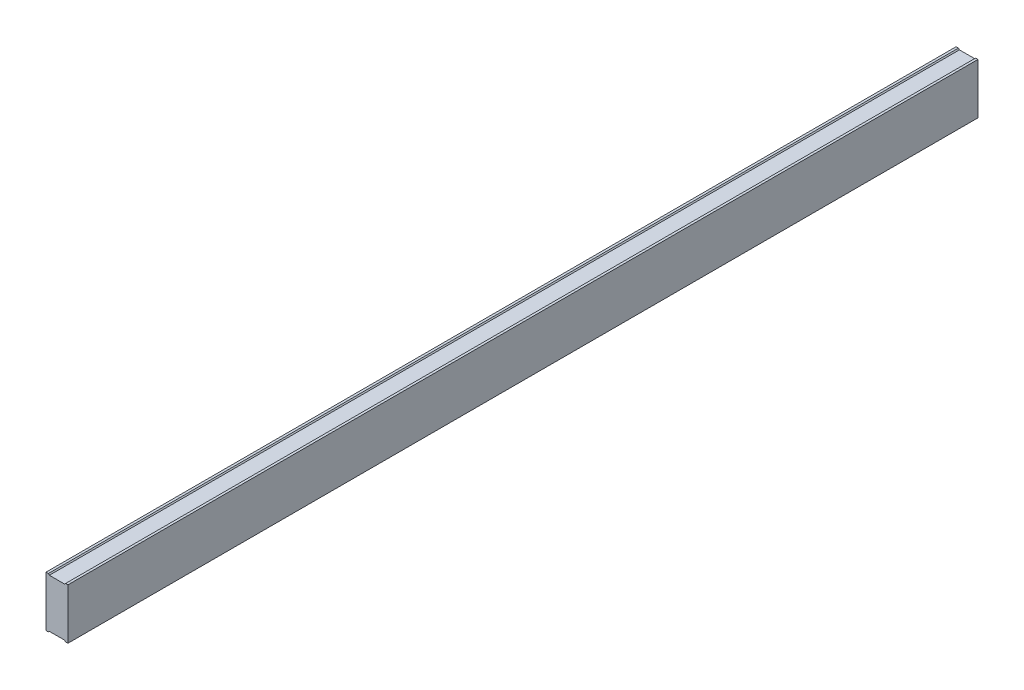
ISO-10303-21;
HEADER;
FILE_DESCRIPTION(('STEP AP214'),'2;1');
FILE_NAME('part.step','',(''),(''),'','','');
FILE_SCHEMA(('AUTOMOTIVE_DESIGN { 1 0 10303 214 1 1 1 1 }'));
ENDSEC;
DATA;
#1=APPLICATION_CONTEXT('core data for automotive mechanical design processes');
#2=APPLICATION_PROTOCOL_DEFINITION('international standard','automotive_design',2000,#1);
#3=PRODUCT_CONTEXT('',#1,'mechanical');
#4=PRODUCT('Part','Part','',(#3));
#5=PRODUCT_RELATED_PRODUCT_CATEGORY('part','',(#4));
#6=PRODUCT_DEFINITION_FORMATION('','',#4);
#7=PRODUCT_DEFINITION_CONTEXT('part definition',#1,'design');
#8=PRODUCT_DEFINITION('design','',#6,#7);
#9=PRODUCT_DEFINITION_SHAPE('','',#8);
#10=(LENGTH_UNIT() NAMED_UNIT(*) SI_UNIT(.MILLI.,.METRE.));
#11=(NAMED_UNIT(*) PLANE_ANGLE_UNIT() SI_UNIT($,.RADIAN.));
#12=(NAMED_UNIT(*) SI_UNIT($,.STERADIAN.) SOLID_ANGLE_UNIT());
#13=UNCERTAINTY_MEASURE_WITH_UNIT(LENGTH_MEASURE(1.E-05),#10,'distance_accuracy_value','');
#14=(GEOMETRIC_REPRESENTATION_CONTEXT(3) GLOBAL_UNCERTAINTY_ASSIGNED_CONTEXT((#13)) GLOBAL_UNIT_ASSIGNED_CONTEXT((#10,
#11,#12)) REPRESENTATION_CONTEXT('',''));
#15=CARTESIAN_POINT('',(0.,0.,0.));
#16=DIRECTION('',(0.,0.,1.));
#17=DIRECTION('',(1.,0.,0.));
#18=AXIS2_PLACEMENT_3D('',#15,#16,#17);
#19=CARTESIAN_POINT('',(11681.2400274227,-58136.4132239477,2697.));
#20=DIRECTION('',(2.45014736468445E-13,1.,0.));
#21=DIRECTION('',(-1.,2.45014736468445E-13,0.));
#22=AXIS2_PLACEMENT_3D('',#19,#20,#21);
#23=PLANE('',#22);
#24=DIRECTION('',(0.,0.,-1.));
#25=VECTOR('',#24,1.);
#26=CARTESIAN_POINT('',(11681.2400274227,-58136.4132239477,2697.));
#27=LINE('',#26,#25);
#28=CARTESIAN_POINT('',(11681.2400274227,-58136.4132239477,2691.));
#29=VERTEX_POINT('',#28);
#30=CARTESIAN_POINT('',(11681.2400274227,-58136.4132239477,5.99999999999978));
#31=VERTEX_POINT('',#30);
#32=EDGE_CURVE('E249',#29,#31,#27,.T.);
#33=ORIENTED_EDGE('',*,*,#32,.T.);
#34=DIRECTION('',(1.,0.,0.));
#35=VECTOR('',#34,1.);
#36=CARTESIAN_POINT('',(11681.2400274227,-58136.4132239477,6.));
#37=LINE('',#36,#35);
#38=CARTESIAN_POINT('',(11739.2400274228,-58136.4132239477,5.99999999999978));
#39=VERTEX_POINT('',#38);
#40=EDGE_CURVE('E51',#31,#39,#37,.T.);
#41=ORIENTED_EDGE('',*,*,#40,.T.);
#42=DIRECTION('',(0.,0.,-1.));
#43=VECTOR('',#42,1.);
#44=CARTESIAN_POINT('',(11739.2400274228,-58136.4132239477,2697.));
#45=LINE('',#44,#43);
#46=CARTESIAN_POINT('',(11739.2400274228,-58136.4132239477,2691.));
#47=VERTEX_POINT('',#46);
#48=EDGE_CURVE('E251',#47,#39,#45,.T.);
#49=ORIENTED_EDGE('',*,*,#48,.F.);
#50=DIRECTION('',(-1.,0.,0.));
#51=VECTOR('',#50,1.);
#52=CARTESIAN_POINT('',(11681.2400274227,-58136.4132239477,2691.));
#53=LINE('',#52,#51);
#54=EDGE_CURVE('E349',#47,#29,#53,.T.);
#55=ORIENTED_EDGE('',*,*,#54,.T.);
#56=EDGE_LOOP('',(#33,#41,#49,#55));
#57=FACE_BOUND('',#56,.T.);
#58=ADVANCED_FACE('F34',(#57),#23,.F.);
#59=CARTESIAN_POINT('',(11739.2400274228,-58139.4132239477,2697.));
#60=DIRECTION('',(0.,0.,-1.));
#61=DIRECTION('',(-1.,0.,0.));
#62=AXIS2_PLACEMENT_3D('',#59,#60,#61);
#63=CYLINDRICAL_SURFACE('',#62,2.99999999999834);
#64=CARTESIAN_POINT('',(11739.2400274228,-58139.4132239477,5.99999999999978));
#65=DIRECTION('',(0.,0.,1.));
#66=DIRECTION('',(1.,0.,0.));
#67=AXIS2_PLACEMENT_3D('',#64,#65,#66);
#68=CIRCLE('',#67,2.99999999999834);
#69=CARTESIAN_POINT('',(11742.2400274228,-58139.4132239477,5.99999999999978));
#70=VERTEX_POINT('',#69);
#71=EDGE_CURVE('E58',#70,#39,#68,.T.);
#72=ORIENTED_EDGE('',*,*,#71,.F.);
#73=DIRECTION('',(0.,0.,-1.));
#74=VECTOR('',#73,1.);
#75=CARTESIAN_POINT('',(11742.2400274228,-58139.4132239477,2697.));
#76=LINE('',#75,#74);
#77=CARTESIAN_POINT('',(11742.2400274228,-58139.4132239477,2691.));
#78=VERTEX_POINT('',#77);
#79=EDGE_CURVE('E253',#78,#70,#76,.T.);
#80=ORIENTED_EDGE('',*,*,#79,.F.);
#81=CARTESIAN_POINT('',(11739.2400274228,-58139.4132239477,2691.));
#82=DIRECTION('',(0.,0.,1.));
#83=DIRECTION('',(1.,0.,0.));
#84=AXIS2_PLACEMENT_3D('',#81,#82,#83);
#85=CIRCLE('',#84,2.99999999999834);
#86=EDGE_CURVE('E190',#78,#47,#85,.T.);
#87=ORIENTED_EDGE('',*,*,#86,.T.);
#88=ORIENTED_EDGE('',*,*,#48,.T.);
#89=EDGE_LOOP('',(#72,#80,#87,#88));
#90=FACE_BOUND('',#89,.T.);
#91=ADVANCED_FACE('F355',(#90),#63,.F.);
#92=CARTESIAN_POINT('',(11742.2400274228,-58139.4132239477,2697.));
#93=DIRECTION('',(1.,0.,0.));
#94=DIRECTION('',(0.,0.,-1.));
#95=AXIS2_PLACEMENT_3D('',#92,#93,#94);
#96=PLANE('',#95);
#97=ORIENTED_EDGE('',*,*,#79,.T.);
#98=DIRECTION('',(0.,-1.,0.));
#99=VECTOR('',#98,1.);
#100=CARTESIAN_POINT('',(11742.2400274228,-58136.4132239477,6.));
#101=LINE('',#100,#99);
#102=CARTESIAN_POINT('',(11742.2400274228,-58267.4132239477,5.99999999999978));
#103=VERTEX_POINT('',#102);
#104=EDGE_CURVE('E336',#70,#103,#101,.T.);
#105=ORIENTED_EDGE('',*,*,#104,.T.);
#106=DIRECTION('',(0.,0.,-1.));
#107=VECTOR('',#106,1.);
#108=CARTESIAN_POINT('',(11742.2400274228,-58267.4132239477,2697.));
#109=LINE('',#108,#107);
#110=CARTESIAN_POINT('',(11742.2400274228,-58267.4132239477,2691.));
#111=VERTEX_POINT('',#110);
#112=EDGE_CURVE('E255',#111,#103,#109,.T.);
#113=ORIENTED_EDGE('',*,*,#112,.F.);
#114=DIRECTION('',(0.,1.,0.));
#115=VECTOR('',#114,1.);
#116=CARTESIAN_POINT('',(11742.2400274228,-58136.4132239477,2691.));
#117=LINE('',#116,#115);
#118=EDGE_CURVE('E347',#111,#78,#117,.T.);
#119=ORIENTED_EDGE('',*,*,#118,.T.);
#120=EDGE_LOOP('',(#97,#105,#113,#119));
#121=FACE_BOUND('',#120,.T.);
#122=ADVANCED_FACE('F364',(#121),#96,.F.);
#123=CARTESIAN_POINT('',(11739.2400274228,-58267.4132239477,2697.));
#124=DIRECTION('',(0.,0.,-1.));
#125=DIRECTION('',(-1.,0.,0.));
#126=AXIS2_PLACEMENT_3D('',#123,#124,#125);
#127=CYLINDRICAL_SURFACE('',#126,2.99999999999212);
#128=ORIENTED_EDGE('',*,*,#112,.T.);
#129=CARTESIAN_POINT('',(11739.2400274228,-58267.4132239477,5.99999999999978));
#130=DIRECTION('',(0.,0.,1.));
#131=DIRECTION('',(1.,0.,0.));
#132=AXIS2_PLACEMENT_3D('',#129,#130,#131);
#133=CIRCLE('',#132,2.99999999999212);
#134=CARTESIAN_POINT('',(11739.2400274228,-58270.4132239477,5.99999999999978));
#135=VERTEX_POINT('',#134);
#136=EDGE_CURVE('E341',#103,#135,#133,.F.);
#137=ORIENTED_EDGE('',*,*,#136,.T.);
#138=DIRECTION('',(0.,0.,-1.));
#139=VECTOR('',#138,1.);
#140=CARTESIAN_POINT('',(11739.2400274228,-58270.4132239477,2697.));
#141=LINE('',#140,#139);
#142=CARTESIAN_POINT('',(11739.2400274228,-58270.4132239477,2691.));
#143=VERTEX_POINT('',#142);
#144=EDGE_CURVE('E258',#143,#135,#141,.T.);
#145=ORIENTED_EDGE('',*,*,#144,.F.);
#146=CARTESIAN_POINT('',(11739.2400274228,-58267.4132239477,2691.));
#147=DIRECTION('',(0.,0.,1.));
#148=DIRECTION('',(1.,0.,0.));
#149=AXIS2_PLACEMENT_3D('',#146,#147,#148);
#150=CIRCLE('',#149,2.99999999999212);
#151=EDGE_CURVE('E350',#111,#143,#150,.F.);
#152=ORIENTED_EDGE('',*,*,#151,.F.);
#153=EDGE_LOOP('',(#128,#137,#145,#152));
#154=FACE_BOUND('',#153,.T.);
#155=ADVANCED_FACE('F361',(#154),#127,.F.);
#156=CARTESIAN_POINT('',(11681.2400274227,-58270.4132239477,2697.));
#157=DIRECTION('',(0.,1.,0.));
#158=DIRECTION('',(0.,0.,1.));
#159=AXIS2_PLACEMENT_3D('',#156,#157,#158);
#160=PLANE('',#159);
#161=DIRECTION('',(-1.,0.,0.));
#162=VECTOR('',#161,1.);
#163=CARTESIAN_POINT('',(11681.2400274227,-58270.4132239477,6.));
#164=LINE('',#163,#162);
#165=CARTESIAN_POINT('',(11681.2400274227,-58270.4132239477,5.99999999999978));
#166=VERTEX_POINT('',#165);
#167=EDGE_CURVE('E334',#135,#166,#164,.T.);
#168=ORIENTED_EDGE('',*,*,#167,.T.);
#169=DIRECTION('',(0.,0.,-1.));
#170=VECTOR('',#169,1.);
#171=CARTESIAN_POINT('',(11681.2400274227,-58270.4132239477,2697.));
#172=LINE('',#171,#170);
#173=CARTESIAN_POINT('',(11681.2400274227,-58270.4132239477,2691.));
#174=VERTEX_POINT('',#173);
#175=EDGE_CURVE('E261',#174,#166,#172,.T.);
#176=ORIENTED_EDGE('',*,*,#175,.F.);
#177=DIRECTION('',(1.,0.,0.));
#178=VECTOR('',#177,1.);
#179=CARTESIAN_POINT('',(11681.2400274227,-58270.4132239477,2691.));
#180=LINE('',#179,#178);
#181=EDGE_CURVE('E345',#174,#143,#180,.T.);
#182=ORIENTED_EDGE('',*,*,#181,.T.);
#183=ORIENTED_EDGE('',*,*,#144,.T.);
#184=EDGE_LOOP('',(#168,#176,#182,#183));
#185=FACE_BOUND('',#184,.T.);
#186=ADVANCED_FACE('F359',(#185),#160,.T.);
#187=CARTESIAN_POINT('',(11739.2400274227,-58128.4132239477,2697.));
#188=DIRECTION('',(0.,1.,0.));
#189=DIRECTION('',(0.,0.,1.));
#190=AXIS2_PLACEMENT_3D('',#187,#188,#189);
#191=PLANE('',#190);
#192=DIRECTION('',(1.,0.,0.));
#193=VECTOR('',#192,1.);
#194=CARTESIAN_POINT('',(11739.2400274227,-58128.4132239477,0.));
#195=LINE('',#194,#193);
#196=CARTESIAN_POINT('',(11739.2400274227,-58128.4132239477,0.));
#197=VERTEX_POINT('',#196);
#198=CARTESIAN_POINT('',(11746.2400274227,-58128.4132239477,0.));
#199=VERTEX_POINT('',#198);
#200=EDGE_CURVE('E215',#197,#199,#195,.T.);
#201=ORIENTED_EDGE('',*,*,#200,.F.);
#202=DIRECTION('',(0.,0.,-1.));
#203=VECTOR('',#202,1.);
#204=CARTESIAN_POINT('',(11739.2400274227,-58128.4132239477,2697.));
#205=LINE('',#204,#203);
#206=CARTESIAN_POINT('',(11739.2400274227,-58128.4132239477,2697.));
#207=VERTEX_POINT('',#206);
#208=EDGE_CURVE('E11',#207,#197,#205,.T.);
#209=ORIENTED_EDGE('',*,*,#208,.F.);
#210=DIRECTION('',(1.,0.,0.));
#211=VECTOR('',#210,1.);
#212=CARTESIAN_POINT('',(11739.2400274227,-58128.4132239477,2697.));
#213=LINE('',#212,#211);
#214=CARTESIAN_POINT('',(11746.2400274227,-58128.4132239477,2697.));
#215=VERTEX_POINT('',#214);
#216=EDGE_CURVE('E177',#207,#215,#213,.T.);
#217=ORIENTED_EDGE('',*,*,#216,.T.);
#218=DIRECTION('',(0.,0.,-1.));
#219=VECTOR('',#218,1.);
#220=CARTESIAN_POINT('',(11746.2400274227,-58128.4132239477,2697.));
#221=LINE('',#220,#219);
#222=EDGE_CURVE('E38',#215,#199,#221,.T.);
#223=ORIENTED_EDGE('',*,*,#222,.T.);
#224=EDGE_LOOP('',(#201,#209,#217,#223));
#225=FACE_BOUND('',#224,.T.);
#226=ADVANCED_FACE('F36',(#225),#191,.T.);
#227=CARTESIAN_POINT('',(11739.2400274227,-58128.4132239477,2697.));
#228=DIRECTION('',(0.707106781190944,-0.707106781182151,0.));
#229=DIRECTION('',(0.707106781182151,0.707106781190944,0.));
#230=AXIS2_PLACEMENT_3D('',#227,#228,#229);
#231=PLANE('',#230);
#232=DIRECTION('',(-0.707106781182151,-0.707106781190944,0.));
#233=VECTOR('',#232,1.);
#234=CARTESIAN_POINT('',(11739.2400274227,-58128.4132239477,0.));
#235=LINE('',#234,#233);
#236=CARTESIAN_POINT('',(11736.2400274227,-58131.4132239477,0.));
#237=VERTEX_POINT('',#236);
#238=EDGE_CURVE('E184',#197,#237,#235,.T.);
#239=ORIENTED_EDGE('',*,*,#238,.T.);
#240=DIRECTION('',(0.,0.,-1.));
#241=VECTOR('',#240,1.);
#242=CARTESIAN_POINT('',(11736.2400274227,-58131.4132239477,2697.));
#243=LINE('',#242,#241);
#244=CARTESIAN_POINT('',(11736.2400274227,-58131.4132239477,2697.));
#245=VERTEX_POINT('',#244);
#246=EDGE_CURVE('E43',#245,#237,#243,.T.);
#247=ORIENTED_EDGE('',*,*,#246,.F.);
#248=DIRECTION('',(-0.707106781182151,-0.707106781190944,0.));
#249=VECTOR('',#248,1.);
#250=CARTESIAN_POINT('',(11739.2400274227,-58128.4132239477,2697.));
#251=LINE('',#250,#249);
#252=EDGE_CURVE('E172',#207,#245,#251,.T.);
#253=ORIENTED_EDGE('',*,*,#252,.F.);
#254=ORIENTED_EDGE('',*,*,#208,.T.);
#255=EDGE_LOOP('',(#239,#247,#253,#254));
#256=FACE_BOUND('',#255,.T.);
#257=ADVANCED_FACE('F285',(#256),#231,.F.);
#258=CARTESIAN_POINT('',(11691.2400274227,-58131.4132239477,2697.));
#259=DIRECTION('',(1.57898385724448E-13,1.,0.));
#260=DIRECTION('',(-1.,1.57898385724448E-13,0.));
#261=AXIS2_PLACEMENT_3D('',#258,#259,#260);
#262=PLANE('',#261);
#263=DIRECTION('',(1.,-1.57898385724448E-13,0.));
#264=VECTOR('',#263,1.);
#265=CARTESIAN_POINT('',(11691.2400274227,-58131.4132239477,0.));
#266=LINE('',#265,#264);
#267=CARTESIAN_POINT('',(11691.2400274227,-58131.4132239477,0.));
#268=VERTEX_POINT('',#267);
#269=EDGE_CURVE('E187',#268,#237,#266,.T.);
#270=ORIENTED_EDGE('',*,*,#269,.F.);
#271=DIRECTION('',(0.,0.,-1.));
#272=VECTOR('',#271,1.);
#273=CARTESIAN_POINT('',(11691.2400274227,-58131.4132239477,2697.));
#274=LINE('',#273,#272);
#275=CARTESIAN_POINT('',(11691.2400274227,-58131.4132239477,2697.));
#276=VERTEX_POINT('',#275);
#277=EDGE_CURVE('E242',#276,#268,#274,.T.);
#278=ORIENTED_EDGE('',*,*,#277,.F.);
#279=DIRECTION('',(1.,-1.57898385724448E-13,0.));
#280=VECTOR('',#279,1.);
#281=CARTESIAN_POINT('',(11691.2400274227,-58131.4132239477,2697.));
#282=LINE('',#281,#280);
#283=EDGE_CURVE('E211',#276,#245,#282,.T.);
#284=ORIENTED_EDGE('',*,*,#283,.T.);
#285=ORIENTED_EDGE('',*,*,#246,.T.);
#286=EDGE_LOOP('',(#270,#278,#284,#285));
#287=FACE_BOUND('',#286,.T.);
#288=ADVANCED_FACE('F382',(#287),#262,.T.);
#289=CARTESIAN_POINT('',(11688.2400274233,-58128.4132239477,2697.));
#290=DIRECTION('',(0.707106781257934,0.707106781115161,0.));
#291=DIRECTION('',(-0.707106781115161,0.707106781257934,0.));
#292=AXIS2_PLACEMENT_3D('',#289,#290,#291);
#293=PLANE('',#292);
#294=DIRECTION('',(0.707106781115161,-0.707106781257934,0.));
#295=VECTOR('',#294,1.);
#296=CARTESIAN_POINT('',(11688.2400274233,-58128.4132239477,0.));
#297=LINE('',#296,#295);
#298=CARTESIAN_POINT('',(11688.2400274233,-58128.4132239477,0.));
#299=VERTEX_POINT('',#298);
#300=EDGE_CURVE('E236',#299,#268,#297,.T.);
#301=ORIENTED_EDGE('',*,*,#300,.F.);
#302=DIRECTION('',(0.,0.,-1.));
#303=VECTOR('',#302,1.);
#304=CARTESIAN_POINT('',(11688.2400274233,-58128.4132239477,2697.));
#305=LINE('',#304,#303);
#306=CARTESIAN_POINT('',(11688.2400274233,-58128.4132239477,2697.));
#307=VERTEX_POINT('',#306);
#308=EDGE_CURVE('E244',#307,#299,#305,.T.);
#309=ORIENTED_EDGE('',*,*,#308,.F.);
#310=DIRECTION('',(0.707106781115161,-0.707106781257934,0.));
#311=VECTOR('',#310,1.);
#312=CARTESIAN_POINT('',(11688.2400274233,-58128.4132239477,2697.));
#313=LINE('',#312,#311);
#314=EDGE_CURVE('E208',#307,#276,#313,.T.);
#315=ORIENTED_EDGE('',*,*,#314,.T.);
#316=ORIENTED_EDGE('',*,*,#277,.T.);
#317=EDGE_LOOP('',(#301,#309,#315,#316));
#318=FACE_BOUND('',#317,.T.);
#319=ADVANCED_FACE('F291',(#318),#293,.T.);
#320=CARTESIAN_POINT('',(11688.2400274233,-58128.4132239477,2697.));
#321=DIRECTION('',(0.,-1.,0.));
#322=DIRECTION('',(0.,0.,-1.));
#323=AXIS2_PLACEMENT_3D('',#320,#321,#322);
#324=PLANE('',#323);
#325=DIRECTION('',(-1.,0.,0.));
#326=VECTOR('',#325,1.);
#327=CARTESIAN_POINT('',(11688.2400274233,-58128.4132239477,0.));
#328=LINE('',#327,#326);
#329=CARTESIAN_POINT('',(11681.2400274227,-58128.4132239477,0.));
#330=VERTEX_POINT('',#329);
#331=EDGE_CURVE('E234',#299,#330,#328,.T.);
#332=ORIENTED_EDGE('',*,*,#331,.T.);
#333=DIRECTION('',(0.,0.,-1.));
#334=VECTOR('',#333,1.);
#335=CARTESIAN_POINT('',(11681.2400274227,-58128.4132239477,2697.));
#336=LINE('',#335,#334);
#337=CARTESIAN_POINT('',(11681.2400274227,-58128.4132239477,2697.));
#338=VERTEX_POINT('',#337);
#339=EDGE_CURVE('E246',#338,#330,#336,.T.);
#340=ORIENTED_EDGE('',*,*,#339,.F.);
#341=DIRECTION('',(-1.,0.,0.));
#342=VECTOR('',#341,1.);
#343=CARTESIAN_POINT('',(11688.2400274233,-58128.4132239477,2697.));
#344=LINE('',#343,#342);
#345=EDGE_CURVE('E206',#307,#338,#344,.T.);
#346=ORIENTED_EDGE('',*,*,#345,.F.);
#347=ORIENTED_EDGE('',*,*,#308,.T.);
#348=EDGE_LOOP('',(#332,#340,#346,#347));
#349=FACE_BOUND('',#348,.T.);
#350=ADVANCED_FACE('F296',(#349),#324,.F.);
#351=CARTESIAN_POINT('',(11681.2400274227,-58128.4132239477,2697.));
#352=DIRECTION('',(1.,-2.22044604924957E-13,0.));
#353=DIRECTION('',(2.22044604924957E-13,1.,0.));
#354=AXIS2_PLACEMENT_3D('',#351,#352,#353);
#355=PLANE('',#354);
#356=DIRECTION('',(-2.22044604924957E-13,-1.,0.));
#357=VECTOR('',#356,1.);
#358=CARTESIAN_POINT('',(11681.2400274227,-58128.4132239477,0.));
#359=LINE('',#358,#357);
#360=CARTESIAN_POINT('',(11681.2400274227,-58278.4132239477,0.));
#361=VERTEX_POINT('',#360);
#362=EDGE_CURVE('E232',#330,#361,#359,.T.);
#363=ORIENTED_EDGE('',*,*,#362,.T.);
#364=DIRECTION('',(0.,0.,-1.));
#365=VECTOR('',#364,1.);
#366=CARTESIAN_POINT('',(11681.2400274227,-58278.4132239477,2697.));
#367=LINE('',#366,#365);
#368=CARTESIAN_POINT('',(11681.2400274227,-58278.4132239477,2697.));
#369=VERTEX_POINT('',#368);
#370=EDGE_CURVE('E264',#369,#361,#367,.T.);
#371=ORIENTED_EDGE('',*,*,#370,.F.);
#372=DIRECTION('',(2.22044604924957E-13,1.,0.));
#373=VECTOR('',#372,1.);
#374=CARTESIAN_POINT('',(11681.2400274227,-58278.4132239477,2697.));
#375=LINE('',#374,#373);
#376=EDGE_CURVE('E204',#369,#338,#375,.T.);
#377=ORIENTED_EDGE('',*,*,#376,.T.);
#378=ORIENTED_EDGE('',*,*,#339,.T.);
#379=EDGE_LOOP('',(#363,#371,#377,#378));
#380=FACE_BOUND('',#379,.T.);
#381=ORIENTED_EDGE('',*,*,#175,.T.);
#382=DIRECTION('',(0.,1.,0.));
#383=VECTOR('',#382,1.);
#384=CARTESIAN_POINT('',(11681.2400274227,-58136.4132239477,6.));
#385=LINE('',#384,#383);
#386=EDGE_CURVE('E324',#166,#31,#385,.T.);
#387=ORIENTED_EDGE('',*,*,#386,.T.);
#388=ORIENTED_EDGE('',*,*,#32,.F.);
#389=DIRECTION('',(0.,-1.,0.));
#390=VECTOR('',#389,1.);
#391=CARTESIAN_POINT('',(11681.2400274227,-58136.4132239477,2691.));
#392=LINE('',#391,#390);
#393=EDGE_CURVE('E326',#29,#174,#392,.T.);
#394=ORIENTED_EDGE('',*,*,#393,.T.);
#395=EDGE_LOOP('',(#381,#387,#388,#394));
#396=FACE_BOUND('',#395,.T.);
#397=ADVANCED_FACE('F316',(#380,#396),#355,.F.);
#398=CARTESIAN_POINT('',(11688.2400274233,-58278.4132239477,2697.));
#399=DIRECTION('',(0.,-1.,0.));
#400=DIRECTION('',(0.,0.,-1.));
#401=AXIS2_PLACEMENT_3D('',#398,#399,#400);
#402=PLANE('',#401);
#403=DIRECTION('',(-1.,0.,0.));
#404=VECTOR('',#403,1.);
#405=CARTESIAN_POINT('',(11688.2400274233,-58278.4132239477,0.));
#406=LINE('',#405,#404);
#407=CARTESIAN_POINT('',(11688.2400274233,-58278.4132239477,0.));
#408=VERTEX_POINT('',#407);
#409=EDGE_CURVE('E229',#408,#361,#406,.T.);
#410=ORIENTED_EDGE('',*,*,#409,.F.);
#411=DIRECTION('',(0.,0.,-1.));
#412=VECTOR('',#411,1.);
#413=CARTESIAN_POINT('',(11688.2400274233,-58278.4132239477,2697.));
#414=LINE('',#413,#412);
#415=CARTESIAN_POINT('',(11688.2400274233,-58278.4132239477,2697.));
#416=VERTEX_POINT('',#415);
#417=EDGE_CURVE('E267',#416,#408,#414,.T.);
#418=ORIENTED_EDGE('',*,*,#417,.F.);
#419=DIRECTION('',(-1.,0.,0.));
#420=VECTOR('',#419,1.);
#421=CARTESIAN_POINT('',(11688.2400274233,-58278.4132239477,2697.));
#422=LINE('',#421,#420);
#423=EDGE_CURVE('E201',#416,#369,#422,.T.);
#424=ORIENTED_EDGE('',*,*,#423,.T.);
#425=ORIENTED_EDGE('',*,*,#370,.T.);
#426=EDGE_LOOP('',(#410,#418,#424,#425));
#427=FACE_BOUND('',#426,.T.);
#428=ADVANCED_FACE('F302',(#427),#402,.T.);
#429=CARTESIAN_POINT('',(11688.2400274233,-58278.4132239477,2697.));
#430=DIRECTION('',(-0.707106781257097,0.707106781115998,0.));
#431=DIRECTION('',(-0.707106781115998,-0.707106781257097,0.));
#432=AXIS2_PLACEMENT_3D('',#429,#430,#431);
#433=PLANE('',#432);
#434=DIRECTION('',(0.707106781115998,0.707106781257097,0.));
#435=VECTOR('',#434,1.);
#436=CARTESIAN_POINT('',(11688.2400274233,-58278.4132239477,0.));
#437=LINE('',#436,#435);
#438=CARTESIAN_POINT('',(11691.2400274227,-58275.4132239477,0.));
#439=VERTEX_POINT('',#438);
#440=EDGE_CURVE('E227',#408,#439,#437,.T.);
#441=ORIENTED_EDGE('',*,*,#440,.T.);
#442=DIRECTION('',(0.,0.,-1.));
#443=VECTOR('',#442,1.);
#444=CARTESIAN_POINT('',(11691.2400274227,-58275.4132239477,2697.));
#445=LINE('',#444,#443);
#446=CARTESIAN_POINT('',(11691.2400274227,-58275.4132239477,2697.));
#447=VERTEX_POINT('',#446);
#448=EDGE_CURVE('E269',#447,#439,#445,.T.);
#449=ORIENTED_EDGE('',*,*,#448,.F.);
#450=DIRECTION('',(0.707106781115998,0.707106781257097,0.));
#451=VECTOR('',#450,1.);
#452=CARTESIAN_POINT('',(11688.2400274233,-58278.4132239477,2697.));
#453=LINE('',#452,#451);
#454=EDGE_CURVE('E199',#416,#447,#453,.T.);
#455=ORIENTED_EDGE('',*,*,#454,.F.);
#456=ORIENTED_EDGE('',*,*,#417,.T.);
#457=EDGE_LOOP('',(#441,#449,#455,#456));
#458=FACE_BOUND('',#457,.T.);
#459=ADVANCED_FACE('F307',(#458),#433,.F.);
#460=CARTESIAN_POINT('',(11691.2400274227,-58275.4132239477,2697.));
#461=DIRECTION('',(0.,1.,0.));
#462=DIRECTION('',(0.,0.,1.));
#463=AXIS2_PLACEMENT_3D('',#460,#461,#462);
#464=PLANE('',#463);
#465=DIRECTION('',(1.,0.,0.));
#466=VECTOR('',#465,1.);
#467=CARTESIAN_POINT('',(11691.2400274227,-58275.4132239477,0.));
#468=LINE('',#467,#466);
#469=CARTESIAN_POINT('',(11736.2400274227,-58275.4132239477,0.));
#470=VERTEX_POINT('',#469);
#471=EDGE_CURVE('E224',#439,#470,#468,.T.);
#472=ORIENTED_EDGE('',*,*,#471,.T.);
#473=DIRECTION('',(0.,0.,-1.));
#474=VECTOR('',#473,1.);
#475=CARTESIAN_POINT('',(11736.2400274227,-58275.4132239477,2697.));
#476=LINE('',#475,#474);
#477=CARTESIAN_POINT('',(11736.2400274227,-58275.4132239477,2697.));
#478=VERTEX_POINT('',#477);
#479=EDGE_CURVE('E272',#478,#470,#476,.T.);
#480=ORIENTED_EDGE('',*,*,#479,.F.);
#481=DIRECTION('',(1.,0.,0.));
#482=VECTOR('',#481,1.);
#483=CARTESIAN_POINT('',(11691.2400274227,-58275.4132239477,2697.));
#484=LINE('',#483,#482);
#485=EDGE_CURVE('E197',#447,#478,#484,.T.);
#486=ORIENTED_EDGE('',*,*,#485,.F.);
#487=ORIENTED_EDGE('',*,*,#448,.T.);
#488=EDGE_LOOP('',(#472,#480,#486,#487));
#489=FACE_BOUND('',#488,.T.);
#490=ADVANCED_FACE('F311',(#489),#464,.F.);
#491=CARTESIAN_POINT('',(11739.2400274227,-58278.4132239477,2697.));
#492=DIRECTION('',(-0.707106781189478,-0.707106781183617,0.));
#493=DIRECTION('',(0.707106781183617,-0.707106781189478,0.));
#494=AXIS2_PLACEMENT_3D('',#491,#492,#493);
#495=PLANE('',#494);
#496=DIRECTION('',(-0.707106781183617,0.707106781189478,0.));
#497=VECTOR('',#496,1.);
#498=CARTESIAN_POINT('',(11739.2400274227,-58278.4132239477,0.));
#499=LINE('',#498,#497);
#500=CARTESIAN_POINT('',(11739.2400274227,-58278.4132239477,0.));
#501=VERTEX_POINT('',#500);
#502=EDGE_CURVE('E221',#501,#470,#499,.T.);
#503=ORIENTED_EDGE('',*,*,#502,.F.);
#504=DIRECTION('',(0.,0.,-1.));
#505=VECTOR('',#504,1.);
#506=CARTESIAN_POINT('',(11739.2400274227,-58278.4132239477,2697.));
#507=LINE('',#506,#505);
#508=CARTESIAN_POINT('',(11739.2400274227,-58278.4132239477,2697.));
#509=VERTEX_POINT('',#508);
#510=EDGE_CURVE('E274',#509,#501,#507,.T.);
#511=ORIENTED_EDGE('',*,*,#510,.F.);
#512=DIRECTION('',(-0.707106781183617,0.707106781189478,0.));
#513=VECTOR('',#512,1.);
#514=CARTESIAN_POINT('',(11739.2400274227,-58278.4132239477,2697.));
#515=LINE('',#514,#513);
#516=EDGE_CURVE('E194',#509,#478,#515,.T.);
#517=ORIENTED_EDGE('',*,*,#516,.T.);
#518=ORIENTED_EDGE('',*,*,#479,.T.);
#519=EDGE_LOOP('',(#503,#511,#517,#518));
#520=FACE_BOUND('',#519,.T.);
#521=ADVANCED_FACE('F314',(#520),#495,.T.);
#522=CARTESIAN_POINT('',(11739.2400274227,-58278.4132239477,2697.));
#523=DIRECTION('',(0.,1.,0.));
#524=DIRECTION('',(0.,0.,1.));
#525=AXIS2_PLACEMENT_3D('',#522,#523,#524);
#526=PLANE('',#525);
#527=DIRECTION('',(1.,0.,0.));
#528=VECTOR('',#527,1.);
#529=CARTESIAN_POINT('',(11739.2400274227,-58278.4132239477,0.));
#530=LINE('',#529,#528);
#531=CARTESIAN_POINT('',(11746.2400274227,-58278.4132239477,0.));
#532=VERTEX_POINT('',#531);
#533=EDGE_CURVE('E218',#501,#532,#530,.T.);
#534=ORIENTED_EDGE('',*,*,#533,.T.);
#535=DIRECTION('',(0.,0.,-1.));
#536=VECTOR('',#535,1.);
#537=CARTESIAN_POINT('',(11746.2400274227,-58278.4132239477,2697.));
#538=LINE('',#537,#536);
#539=CARTESIAN_POINT('',(11746.2400274227,-58278.4132239477,2697.));
#540=VERTEX_POINT('',#539);
#541=EDGE_CURVE('E171',#540,#532,#538,.T.);
#542=ORIENTED_EDGE('',*,*,#541,.F.);
#543=DIRECTION('',(1.,0.,0.));
#544=VECTOR('',#543,1.);
#545=CARTESIAN_POINT('',(11739.2400274227,-58278.4132239477,2697.));
#546=LINE('',#545,#544);
#547=EDGE_CURVE('E180',#509,#540,#546,.T.);
#548=ORIENTED_EDGE('',*,*,#547,.F.);
#549=ORIENTED_EDGE('',*,*,#510,.T.);
#550=EDGE_LOOP('',(#534,#542,#548,#549));
#551=FACE_BOUND('',#550,.T.);
#552=ADVANCED_FACE('F277',(#551),#526,.F.);
#553=CARTESIAN_POINT('',(11746.2400274227,-58128.4132239477,2697.));
#554=DIRECTION('',(1.,0.,0.));
#555=DIRECTION('',(0.,1.,0.));
#556=AXIS2_PLACEMENT_3D('',#553,#554,#555);
#557=PLANE('',#556);
#558=DIRECTION('',(0.,-1.,0.));
#559=VECTOR('',#558,1.);
#560=CARTESIAN_POINT('',(11746.2400274227,-58128.4132239477,0.));
#561=LINE('',#560,#559);
#562=EDGE_CURVE('E166',#199,#532,#561,.T.);
#563=ORIENTED_EDGE('',*,*,#562,.F.);
#564=ORIENTED_EDGE('',*,*,#222,.F.);
#565=DIRECTION('',(0.,-1.,0.));
#566=VECTOR('',#565,1.);
#567=CARTESIAN_POINT('',(11746.2400274227,-58128.4132239477,2697.));
#568=LINE('',#567,#566);
#569=EDGE_CURVE('E164',#215,#540,#568,.T.);
#570=ORIENTED_EDGE('',*,*,#569,.T.);
#571=ORIENTED_EDGE('',*,*,#541,.T.);
#572=EDGE_LOOP('',(#563,#564,#570,#571));
#573=FACE_BOUND('',#572,.T.);
#574=ADVANCED_FACE('F163',(#573),#557,.T.);
#575=CARTESIAN_POINT('',(11739.2400274228,-58267.4132239477,2697.));
#576=DIRECTION('',(0.,0.,-1.));
#577=DIRECTION('',(-1.,0.,0.));
#578=AXIS2_PLACEMENT_3D('',#575,#576,#577);
#579=PLANE('',#578);
#580=ORIENTED_EDGE('',*,*,#345,.T.);
#581=ORIENTED_EDGE('',*,*,#376,.F.);
#582=ORIENTED_EDGE('',*,*,#423,.F.);
#583=ORIENTED_EDGE('',*,*,#454,.T.);
#584=ORIENTED_EDGE('',*,*,#485,.T.);
#585=ORIENTED_EDGE('',*,*,#516,.F.);
#586=ORIENTED_EDGE('',*,*,#547,.T.);
#587=ORIENTED_EDGE('',*,*,#569,.F.);
#588=ORIENTED_EDGE('',*,*,#216,.F.);
#589=ORIENTED_EDGE('',*,*,#252,.T.);
#590=ORIENTED_EDGE('',*,*,#283,.F.);
#591=ORIENTED_EDGE('',*,*,#314,.F.);
#592=EDGE_LOOP('',(#580,#581,#582,#583,#584,#585,#586,#587,#588,#589,#590,#591));
#593=FACE_BOUND('',#592,.T.);
#594=ADVANCED_FACE('F176',(#593),#579,.F.);
#595=CARTESIAN_POINT('',(11739.2400274228,-58267.4132239477,0.));
#596=DIRECTION('',(0.,0.,-1.));
#597=DIRECTION('',(-1.,0.,0.));
#598=AXIS2_PLACEMENT_3D('',#595,#596,#597);
#599=PLANE('',#598);
#600=ORIENTED_EDGE('',*,*,#409,.T.);
#601=ORIENTED_EDGE('',*,*,#362,.F.);
#602=ORIENTED_EDGE('',*,*,#331,.F.);
#603=ORIENTED_EDGE('',*,*,#300,.T.);
#604=ORIENTED_EDGE('',*,*,#269,.T.);
#605=ORIENTED_EDGE('',*,*,#238,.F.);
#606=ORIENTED_EDGE('',*,*,#200,.T.);
#607=ORIENTED_EDGE('',*,*,#562,.T.);
#608=ORIENTED_EDGE('',*,*,#533,.F.);
#609=ORIENTED_EDGE('',*,*,#502,.T.);
#610=ORIENTED_EDGE('',*,*,#471,.F.);
#611=ORIENTED_EDGE('',*,*,#440,.F.);
#612=EDGE_LOOP('',(#600,#601,#602,#603,#604,#605,#606,#607,#608,#609,#610,#611));
#613=FACE_BOUND('',#612,.T.);
#614=ADVANCED_FACE('F280',(#613),#599,.T.);
#615=CARTESIAN_POINT('',(0.,0.,2691.));
#616=DIRECTION('',(0.,0.,1.));
#617=DIRECTION('',(1.,0.,0.));
#618=AXIS2_PLACEMENT_3D('',#615,#616,#617);
#619=PLANE('',#618);
#620=ORIENTED_EDGE('',*,*,#86,.F.);
#621=ORIENTED_EDGE('',*,*,#118,.F.);
#622=ORIENTED_EDGE('',*,*,#151,.T.);
#623=ORIENTED_EDGE('',*,*,#181,.F.);
#624=ORIENTED_EDGE('',*,*,#393,.F.);
#625=ORIENTED_EDGE('',*,*,#54,.F.);
#626=EDGE_LOOP('',(#620,#621,#622,#623,#624,#625));
#627=FACE_BOUND('',#626,.T.);
#628=ADVANCED_FACE('F357',(#627),#619,.F.);
#629=CARTESIAN_POINT('',(0.,0.,6.));
#630=DIRECTION('',(0.,0.,1.));
#631=DIRECTION('',(1.,0.,0.));
#632=AXIS2_PLACEMENT_3D('',#629,#630,#631);
#633=PLANE('',#632);
#634=ORIENTED_EDGE('',*,*,#104,.F.);
#635=ORIENTED_EDGE('',*,*,#71,.T.);
#636=ORIENTED_EDGE('',*,*,#40,.F.);
#637=ORIENTED_EDGE('',*,*,#386,.F.);
#638=ORIENTED_EDGE('',*,*,#167,.F.);
#639=ORIENTED_EDGE('',*,*,#136,.F.);
#640=EDGE_LOOP('',(#634,#635,#636,#637,#638,#639));
#641=FACE_BOUND('',#640,.T.);
#642=ADVANCED_FACE('F332',(#641),#633,.T.);
#643=CLOSED_SHELL('',(#58,#91,#122,#155,#186,#226,#257,#288,#319,#350,#397,#428,#459,#490,#521,
#552,#574,#594,#614,#628,#642));
#644=MANIFOLD_SOLID_BREP('B2',#643);
#645=ADVANCED_BREP_SHAPE_REPRESENTATION('',(#18,#644),#14);
#646=SHAPE_DEFINITION_REPRESENTATION(#9,#645);
ENDSEC;
END-ISO-10303-21;
